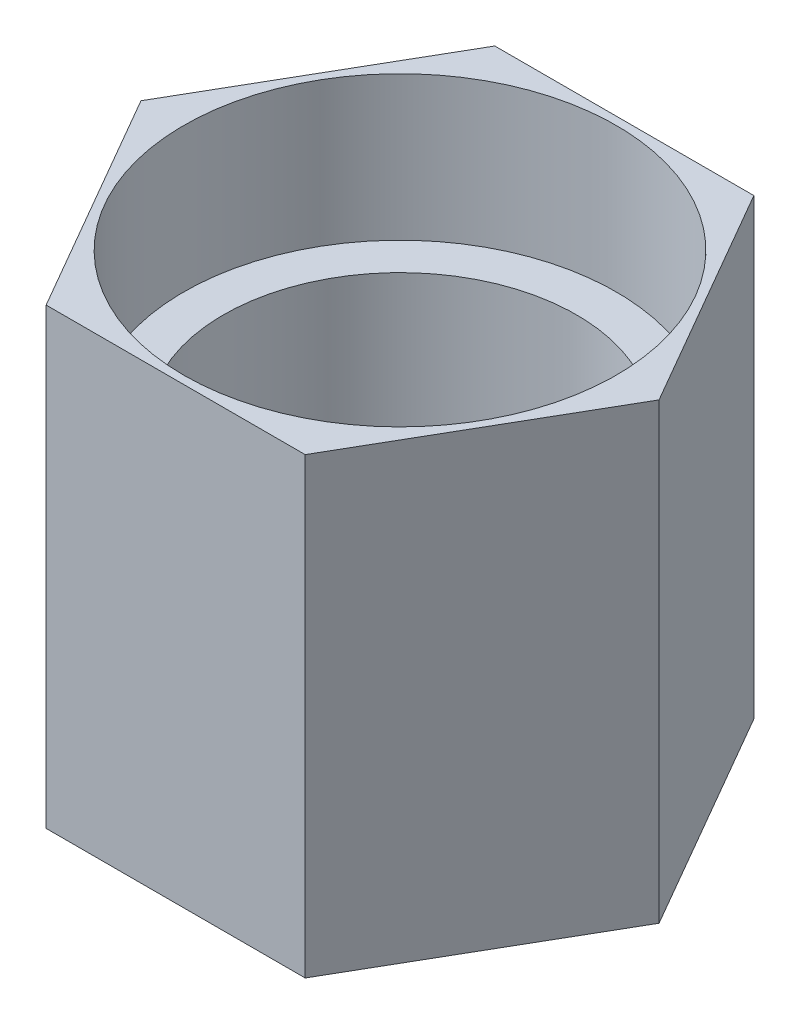
ISO-10303-21;
HEADER;
FILE_DESCRIPTION(('STEP AP214'),'2;1');
FILE_NAME('part.step','',(''),(''),'','','');
FILE_SCHEMA(('AUTOMOTIVE_DESIGN { 1 0 10303 214 1 1 1 1 }'));
ENDSEC;
DATA;
#1=APPLICATION_CONTEXT('core data for automotive mechanical design processes');
#2=APPLICATION_PROTOCOL_DEFINITION('international standard','automotive_design',2000,#1);
#3=PRODUCT_CONTEXT('',#1,'mechanical');
#4=PRODUCT('Part','Part','',(#3));
#5=PRODUCT_RELATED_PRODUCT_CATEGORY('part','',(#4));
#6=PRODUCT_DEFINITION_FORMATION('','',#4);
#7=PRODUCT_DEFINITION_CONTEXT('part definition',#1,'design');
#8=PRODUCT_DEFINITION('design','',#6,#7);
#9=PRODUCT_DEFINITION_SHAPE('','',#8);
#10=(LENGTH_UNIT() NAMED_UNIT(*) SI_UNIT(.MILLI.,.METRE.));
#11=(NAMED_UNIT(*) PLANE_ANGLE_UNIT() SI_UNIT($,.RADIAN.));
#12=(NAMED_UNIT(*) SI_UNIT($,.STERADIAN.) SOLID_ANGLE_UNIT());
#13=UNCERTAINTY_MEASURE_WITH_UNIT(LENGTH_MEASURE(1.E-05),#10,'distance_accuracy_value','');
#14=(GEOMETRIC_REPRESENTATION_CONTEXT(3) GLOBAL_UNCERTAINTY_ASSIGNED_CONTEXT((#13)) GLOBAL_UNIT_ASSIGNED_CONTEXT((#10,
#11,#12)) REPRESENTATION_CONTEXT('',''));
#15=CARTESIAN_POINT('',(0.,0.,0.));
#16=DIRECTION('',(0.,0.,1.));
#17=DIRECTION('',(1.,0.,0.));
#18=AXIS2_PLACEMENT_3D('',#15,#16,#17);
#19=CARTESIAN_POINT('',(0.,-6.2865,0.));
#20=DIRECTION('',(0.,1.,0.));
#21=DIRECTION('',(0.,0.,1.));
#22=AXIS2_PLACEMENT_3D('',#19,#20,#21);
#23=CYLINDRICAL_SURFACE('',#22,6.);
#24=CARTESIAN_POINT('',(0.,-6.2865,0.));
#25=DIRECTION('',(0.,1.,0.));
#26=DIRECTION('',(0.,0.,1.));
#27=AXIS2_PLACEMENT_3D('',#24,#25,#26);
#28=CIRCLE('',#27,6.);
#29=CARTESIAN_POINT('',(0.,-6.2865,6.));
#30=VERTEX_POINT('',#29);
#31=EDGE_CURVE('E148',#30,#30,#28,.T.);
#32=ORIENTED_EDGE('',*,*,#31,.F.);
#33=EDGE_LOOP('',(#32));
#34=FACE_BOUND('',#33,.T.);
#35=CARTESIAN_POINT('',(0.,-2.2865,0.));
#36=DIRECTION('',(0.,1.,0.));
#37=DIRECTION('',(0.,0.,1.));
#38=AXIS2_PLACEMENT_3D('',#35,#36,#37);
#39=CIRCLE('',#38,6.);
#40=CARTESIAN_POINT('',(0.,-2.2865,6.));
#41=VERTEX_POINT('',#40);
#42=EDGE_CURVE('E11',#41,#41,#39,.F.);
#43=ORIENTED_EDGE('',*,*,#42,.F.);
#44=EDGE_LOOP('',(#43));
#45=FACE_BOUND('',#44,.T.);
#46=ADVANCED_FACE('F51',(#34,#45),#23,.F.);
#47=CARTESIAN_POINT('',(3.59285072516704,-6.2865,-6.223));
#48=DIRECTION('',(0.,0.,-1.));
#49=DIRECTION('',(-1.,0.,0.));
#50=AXIS2_PLACEMENT_3D('',#47,#48,#49);
#51=PLANE('',#50);
#52=DIRECTION('',(0.,1.,0.));
#53=VECTOR('',#52,1.);
#54=CARTESIAN_POINT('',(-3.59285072516704,-6.2865,-6.223));
#55=LINE('',#54,#53);
#56=CARTESIAN_POINT('',(-3.59285072516704,-6.2865,-6.223));
#57=VERTEX_POINT('',#56);
#58=CARTESIAN_POINT('',(-3.59285072516704,6.2865,-6.223));
#59=VERTEX_POINT('',#58);
#60=EDGE_CURVE('E103',#57,#59,#55,.T.);
#61=ORIENTED_EDGE('',*,*,#60,.T.);
#62=DIRECTION('',(-1.,0.,0.));
#63=VECTOR('',#62,1.);
#64=CARTESIAN_POINT('',(3.59285072516704,6.2865,-6.223));
#65=LINE('',#64,#63);
#66=CARTESIAN_POINT('',(3.59285072516704,6.2865,-6.223));
#67=VERTEX_POINT('',#66);
#68=EDGE_CURVE('E106',#67,#59,#65,.T.);
#69=ORIENTED_EDGE('',*,*,#68,.F.);
#70=DIRECTION('',(0.,1.,0.));
#71=VECTOR('',#70,1.);
#72=CARTESIAN_POINT('',(3.59285072516704,-6.2865,-6.223));
#73=LINE('',#72,#71);
#74=CARTESIAN_POINT('',(3.59285072516704,-6.2865,-6.223));
#75=VERTEX_POINT('',#74);
#76=EDGE_CURVE('E60',#75,#67,#73,.T.);
#77=ORIENTED_EDGE('',*,*,#76,.F.);
#78=DIRECTION('',(-1.,0.,0.));
#79=VECTOR('',#78,1.);
#80=CARTESIAN_POINT('',(3.59285072516704,-6.2865,-6.223));
#81=LINE('',#80,#79);
#82=EDGE_CURVE('E107',#75,#57,#81,.T.);
#83=ORIENTED_EDGE('',*,*,#82,.T.);
#84=EDGE_LOOP('',(#61,#69,#77,#83));
#85=FACE_BOUND('',#84,.T.);
#86=ADVANCED_FACE('F53',(#85),#51,.T.);
#87=CARTESIAN_POINT('',(7.18570145033408,-6.2865,0.));
#88=DIRECTION('',(0.866025403784438,0.,-0.5));
#89=DIRECTION('',(-0.5,0.,-0.866025403784439));
#90=AXIS2_PLACEMENT_3D('',#87,#88,#89);
#91=PLANE('',#90);
#92=ORIENTED_EDGE('',*,*,#76,.T.);
#93=DIRECTION('',(-0.5,0.,-0.866025403784439));
#94=VECTOR('',#93,1.);
#95=CARTESIAN_POINT('',(7.18570145033408,6.2865,0.));
#96=LINE('',#95,#94);
#97=CARTESIAN_POINT('',(7.18570145033408,6.2865,0.));
#98=VERTEX_POINT('',#97);
#99=EDGE_CURVE('E127',#98,#67,#96,.T.);
#100=ORIENTED_EDGE('',*,*,#99,.F.);
#101=DIRECTION('',(0.,1.,0.));
#102=VECTOR('',#101,1.);
#103=CARTESIAN_POINT('',(7.18570145033408,-6.2865,0.));
#104=LINE('',#103,#102);
#105=CARTESIAN_POINT('',(7.18570145033408,-6.2865,0.));
#106=VERTEX_POINT('',#105);
#107=EDGE_CURVE('E74',#106,#98,#104,.T.);
#108=ORIENTED_EDGE('',*,*,#107,.F.);
#109=DIRECTION('',(-0.5,0.,-0.866025403784439));
#110=VECTOR('',#109,1.);
#111=CARTESIAN_POINT('',(7.18570145033408,-6.2865,0.));
#112=LINE('',#111,#110);
#113=EDGE_CURVE('E113',#106,#75,#112,.T.);
#114=ORIENTED_EDGE('',*,*,#113,.T.);
#115=EDGE_LOOP('',(#92,#100,#108,#114));
#116=FACE_BOUND('',#115,.T.);
#117=ADVANCED_FACE('F195',(#116),#91,.T.);
#118=CARTESIAN_POINT('',(3.59285072516705,-6.2865,6.223));
#119=DIRECTION('',(0.866025403784439,0.,0.5));
#120=DIRECTION('',(0.5,0.,-0.866025403784439));
#121=AXIS2_PLACEMENT_3D('',#118,#119,#120);
#122=PLANE('',#121);
#123=ORIENTED_EDGE('',*,*,#107,.T.);
#124=DIRECTION('',(0.5,0.,-0.866025403784439));
#125=VECTOR('',#124,1.);
#126=CARTESIAN_POINT('',(3.59285072516705,6.2865,6.223));
#127=LINE('',#126,#125);
#128=CARTESIAN_POINT('',(3.59285072516705,6.2865,6.223));
#129=VERTEX_POINT('',#128);
#130=EDGE_CURVE('E143',#129,#98,#127,.T.);
#131=ORIENTED_EDGE('',*,*,#130,.F.);
#132=DIRECTION('',(0.,1.,0.));
#133=VECTOR('',#132,1.);
#134=CARTESIAN_POINT('',(3.59285072516705,-6.2865,6.223));
#135=LINE('',#134,#133);
#136=CARTESIAN_POINT('',(3.59285072516705,-6.2865,6.223));
#137=VERTEX_POINT('',#136);
#138=EDGE_CURVE('E174',#137,#129,#135,.T.);
#139=ORIENTED_EDGE('',*,*,#138,.F.);
#140=DIRECTION('',(0.5,0.,-0.866025403784439));
#141=VECTOR('',#140,1.);
#142=CARTESIAN_POINT('',(3.59285072516705,-6.2865,6.223));
#143=LINE('',#142,#141);
#144=EDGE_CURVE('E165',#137,#106,#143,.T.);
#145=ORIENTED_EDGE('',*,*,#144,.T.);
#146=EDGE_LOOP('',(#123,#131,#139,#145));
#147=FACE_BOUND('',#146,.T.);
#148=ADVANCED_FACE('F191',(#147),#122,.T.);
#149=CARTESIAN_POINT('',(-3.59285072516704,-6.2865,6.223));
#150=DIRECTION('',(0.,0.,1.));
#151=DIRECTION('',(1.,0.,0.));
#152=AXIS2_PLACEMENT_3D('',#149,#150,#151);
#153=PLANE('',#152);
#154=ORIENTED_EDGE('',*,*,#138,.T.);
#155=DIRECTION('',(1.,0.,0.));
#156=VECTOR('',#155,1.);
#157=CARTESIAN_POINT('',(-3.59285072516704,6.2865,6.223));
#158=LINE('',#157,#156);
#159=CARTESIAN_POINT('',(-3.59285072516704,6.2865,6.223));
#160=VERTEX_POINT('',#159);
#161=EDGE_CURVE('E139',#160,#129,#158,.T.);
#162=ORIENTED_EDGE('',*,*,#161,.F.);
#163=DIRECTION('',(0.,1.,0.));
#164=VECTOR('',#163,1.);
#165=CARTESIAN_POINT('',(-3.59285072516704,-6.2865,6.223));
#166=LINE('',#165,#164);
#167=CARTESIAN_POINT('',(-3.59285072516704,-6.2865,6.223));
#168=VERTEX_POINT('',#167);
#169=EDGE_CURVE('E177',#168,#160,#166,.T.);
#170=ORIENTED_EDGE('',*,*,#169,.F.);
#171=DIRECTION('',(1.,0.,0.));
#172=VECTOR('',#171,1.);
#173=CARTESIAN_POINT('',(-3.59285072516704,-6.2865,6.223));
#174=LINE('',#173,#172);
#175=EDGE_CURVE('E161',#168,#137,#174,.T.);
#176=ORIENTED_EDGE('',*,*,#175,.T.);
#177=EDGE_LOOP('',(#154,#162,#170,#176));
#178=FACE_BOUND('',#177,.T.);
#179=ADVANCED_FACE('F188',(#178),#153,.T.);
#180=CARTESIAN_POINT('',(-7.18570145033408,-6.2865,0.));
#181=DIRECTION('',(-0.866025403784438,0.,0.5));
#182=DIRECTION('',(0.5,0.,0.866025403784438));
#183=AXIS2_PLACEMENT_3D('',#180,#181,#182);
#184=PLANE('',#183);
#185=ORIENTED_EDGE('',*,*,#169,.T.);
#186=DIRECTION('',(0.5,0.,0.866025403784438));
#187=VECTOR('',#186,1.);
#188=CARTESIAN_POINT('',(-7.18570145033408,6.2865,0.));
#189=LINE('',#188,#187);
#190=CARTESIAN_POINT('',(-7.18570145033408,6.2865,0.));
#191=VERTEX_POINT('',#190);
#192=EDGE_CURVE('E121',#191,#160,#189,.T.);
#193=ORIENTED_EDGE('',*,*,#192,.F.);
#194=DIRECTION('',(0.,1.,0.));
#195=VECTOR('',#194,1.);
#196=CARTESIAN_POINT('',(-7.18570145033408,-6.2865,0.));
#197=LINE('',#196,#195);
#198=CARTESIAN_POINT('',(-7.18570145033408,-6.2865,0.));
#199=VERTEX_POINT('',#198);
#200=EDGE_CURVE('E112',#199,#191,#197,.T.);
#201=ORIENTED_EDGE('',*,*,#200,.F.);
#202=DIRECTION('',(0.5,0.,0.866025403784438));
#203=VECTOR('',#202,1.);
#204=CARTESIAN_POINT('',(-7.18570145033408,-6.2865,0.));
#205=LINE('',#204,#203);
#206=EDGE_CURVE('E157',#199,#168,#205,.T.);
#207=ORIENTED_EDGE('',*,*,#206,.T.);
#208=EDGE_LOOP('',(#185,#193,#201,#207));
#209=FACE_BOUND('',#208,.T.);
#210=ADVANCED_FACE('F182',(#209),#184,.T.);
#211=CARTESIAN_POINT('',(-3.59285072516704,-6.2865,-6.223));
#212=DIRECTION('',(-0.866025403784439,0.,-0.5));
#213=DIRECTION('',(-0.5,0.,0.866025403784439));
#214=AXIS2_PLACEMENT_3D('',#211,#212,#213);
#215=PLANE('',#214);
#216=ORIENTED_EDGE('',*,*,#200,.T.);
#217=DIRECTION('',(-0.5,0.,0.866025403784439));
#218=VECTOR('',#217,1.);
#219=CARTESIAN_POINT('',(-3.59285072516704,6.2865,-6.223));
#220=LINE('',#219,#218);
#221=EDGE_CURVE('E115',#59,#191,#220,.T.);
#222=ORIENTED_EDGE('',*,*,#221,.F.);
#223=ORIENTED_EDGE('',*,*,#60,.F.);
#224=DIRECTION('',(-0.5,0.,0.866025403784439));
#225=VECTOR('',#224,1.);
#226=CARTESIAN_POINT('',(-3.59285072516704,-6.2865,-6.223));
#227=LINE('',#226,#225);
#228=EDGE_CURVE('E154',#57,#199,#227,.T.);
#229=ORIENTED_EDGE('',*,*,#228,.T.);
#230=EDGE_LOOP('',(#216,#222,#223,#229));
#231=FACE_BOUND('',#230,.T.);
#232=ADVANCED_FACE('F116',(#231),#215,.T.);
#233=CARTESIAN_POINT('',(0.,-6.2865,0.));
#234=DIRECTION('',(0.,1.,0.));
#235=DIRECTION('',(0.,0.,1.));
#236=AXIS2_PLACEMENT_3D('',#233,#234,#235);
#237=PLANE('',#236);
#238=ORIENTED_EDGE('',*,*,#31,.T.);
#239=EDGE_LOOP('',(#238));
#240=FACE_BOUND('',#239,.T.);
#241=ORIENTED_EDGE('',*,*,#82,.F.);
#242=ORIENTED_EDGE('',*,*,#113,.F.);
#243=ORIENTED_EDGE('',*,*,#144,.F.);
#244=ORIENTED_EDGE('',*,*,#175,.F.);
#245=ORIENTED_EDGE('',*,*,#206,.F.);
#246=ORIENTED_EDGE('',*,*,#228,.F.);
#247=EDGE_LOOP('',(#241,#242,#243,#244,#245,#246));
#248=FACE_BOUND('',#247,.T.);
#249=ADVANCED_FACE('F194',(#240,#248),#237,.F.);
#250=CARTESIAN_POINT('',(0.,2.2865,0.));
#251=DIRECTION('',(0.,1.,0.));
#252=DIRECTION('',(0.,0.,1.));
#253=AXIS2_PLACEMENT_3D('',#250,#251,#252);
#254=CIRCLE('',#253,6.);
#255=CARTESIAN_POINT('',(0.,2.2865,6.));
#256=VERTEX_POINT('',#255);
#257=EDGE_CURVE('E224',#256,#256,#254,.T.);
#258=ORIENTED_EDGE('',*,*,#257,.F.);
#259=EDGE_LOOP('',(#258));
#260=FACE_BOUND('',#259,.T.);
#261=CARTESIAN_POINT('',(0.,6.2865,0.));
#262=DIRECTION('',(0.,1.,0.));
#263=DIRECTION('',(0.,0.,1.));
#264=AXIS2_PLACEMENT_3D('',#261,#262,#263);
#265=CIRCLE('',#264,6.);
#266=CARTESIAN_POINT('',(0.,6.2865,6.));
#267=VERTEX_POINT('',#266);
#268=EDGE_CURVE('E129',#267,#267,#265,.T.);
#269=ORIENTED_EDGE('',*,*,#268,.T.);
#270=EDGE_LOOP('',(#269));
#271=FACE_BOUND('',#270,.T.);
#272=ADVANCED_FACE('F207',(#260,#271),#23,.F.);
#273=CARTESIAN_POINT('',(0.,6.2865,0.));
#274=DIRECTION('',(0.,1.,0.));
#275=DIRECTION('',(0.,0.,1.));
#276=AXIS2_PLACEMENT_3D('',#273,#274,#275);
#277=PLANE('',#276);
#278=ORIENTED_EDGE('',*,*,#68,.T.);
#279=ORIENTED_EDGE('',*,*,#221,.T.);
#280=ORIENTED_EDGE('',*,*,#192,.T.);
#281=ORIENTED_EDGE('',*,*,#161,.T.);
#282=ORIENTED_EDGE('',*,*,#130,.T.);
#283=ORIENTED_EDGE('',*,*,#99,.T.);
#284=EDGE_LOOP('',(#278,#279,#280,#281,#282,#283));
#285=FACE_BOUND('',#284,.T.);
#286=ORIENTED_EDGE('',*,*,#268,.F.);
#287=EDGE_LOOP('',(#286));
#288=FACE_BOUND('',#287,.T.);
#289=ADVANCED_FACE('F124',(#285,#288),#277,.T.);
#290=CARTESIAN_POINT('',(0.,-2.2865,0.));
#291=DIRECTION('',(0.,1.,0.));
#292=DIRECTION('',(0.,0.,1.));
#293=AXIS2_PLACEMENT_3D('',#290,#291,#292);
#294=PLANE('',#293);
#295=CARTESIAN_POINT('',(0.,-2.2865,0.));
#296=DIRECTION('',(0.,1.,0.));
#297=DIRECTION('',(0.,0.,1.));
#298=AXIS2_PLACEMENT_3D('',#295,#296,#297);
#299=CIRCLE('',#298,4.9);
#300=CARTESIAN_POINT('',(0.,-2.2865,4.9));
#301=VERTEX_POINT('',#300);
#302=EDGE_CURVE('E133',#301,#301,#299,.T.);
#303=ORIENTED_EDGE('',*,*,#302,.T.);
#304=EDGE_LOOP('',(#303));
#305=FACE_BOUND('',#304,.T.);
#306=ORIENTED_EDGE('',*,*,#42,.T.);
#307=EDGE_LOOP('',(#306));
#308=FACE_BOUND('',#307,.T.);
#309=ADVANCED_FACE('F219',(#305,#308),#294,.F.);
#310=CARTESIAN_POINT('',(0.,-2.2865,0.));
#311=DIRECTION('',(0.,1.,0.));
#312=DIRECTION('',(0.,0.,1.));
#313=AXIS2_PLACEMENT_3D('',#310,#311,#312);
#314=CYLINDRICAL_SURFACE('',#313,4.9);
#315=ORIENTED_EDGE('',*,*,#302,.F.);
#316=EDGE_LOOP('',(#315));
#317=FACE_BOUND('',#316,.T.);
#318=CARTESIAN_POINT('',(0.,2.2865,0.));
#319=DIRECTION('',(0.,1.,0.));
#320=DIRECTION('',(0.,0.,1.));
#321=AXIS2_PLACEMENT_3D('',#318,#319,#320);
#322=CIRCLE('',#321,4.9);
#323=CARTESIAN_POINT('',(0.,2.2865,4.9));
#324=VERTEX_POINT('',#323);
#325=EDGE_CURVE('E228',#324,#324,#322,.T.);
#326=ORIENTED_EDGE('',*,*,#325,.T.);
#327=EDGE_LOOP('',(#326));
#328=FACE_BOUND('',#327,.T.);
#329=ADVANCED_FACE('F237',(#317,#328),#314,.F.);
#330=CARTESIAN_POINT('',(0.,2.2865,0.));
#331=DIRECTION('',(0.,1.,0.));
#332=DIRECTION('',(0.,0.,1.));
#333=AXIS2_PLACEMENT_3D('',#330,#331,#332);
#334=PLANE('',#333);
#335=ORIENTED_EDGE('',*,*,#257,.T.);
#336=EDGE_LOOP('',(#335));
#337=FACE_BOUND('',#336,.T.);
#338=ORIENTED_EDGE('',*,*,#325,.F.);
#339=EDGE_LOOP('',(#338));
#340=FACE_BOUND('',#339,.T.);
#341=ADVANCED_FACE('F239',(#337,#340),#334,.T.);
#342=CLOSED_SHELL('',(#46,#86,#117,#148,#179,#210,#232,#249,#272,#289,#309,#329,#341));
#343=MANIFOLD_SOLID_BREP('B2',#342);
#344=ADVANCED_BREP_SHAPE_REPRESENTATION('',(#18,#343),#14);
#345=SHAPE_DEFINITION_REPRESENTATION(#9,#344);
ENDSEC;
END-ISO-10303-21;
